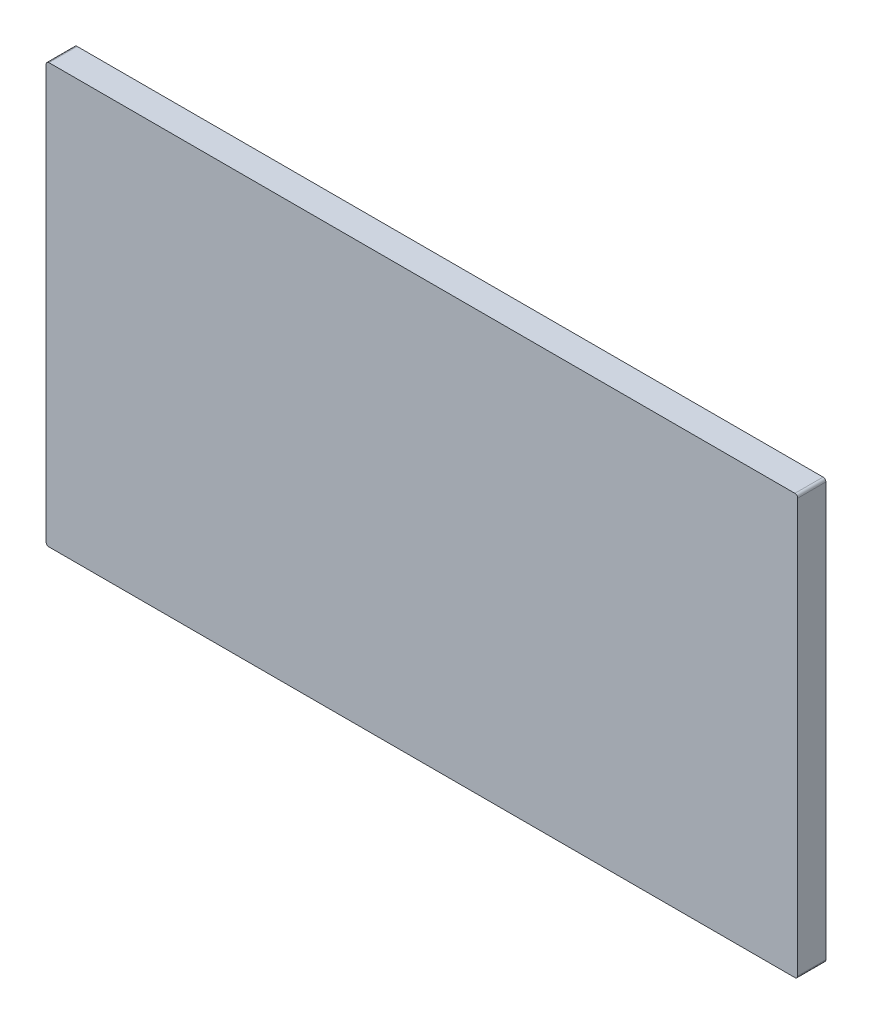
ISO-10303-21;
HEADER;
FILE_DESCRIPTION(('STEP AP214'),'2;1');
FILE_NAME('part.step','',(''),(''),'','','');
FILE_SCHEMA(('AUTOMOTIVE_DESIGN { 1 0 10303 214 1 1 1 1 }'));
ENDSEC;
DATA;
#1=APPLICATION_CONTEXT('core data for automotive mechanical design processes');
#2=APPLICATION_PROTOCOL_DEFINITION('international standard','automotive_design',2000,#1);
#3=PRODUCT_CONTEXT('',#1,'mechanical');
#4=PRODUCT('Part','Part','',(#3));
#5=PRODUCT_RELATED_PRODUCT_CATEGORY('part','',(#4));
#6=PRODUCT_DEFINITION_FORMATION('','',#4);
#7=PRODUCT_DEFINITION_CONTEXT('part definition',#1,'design');
#8=PRODUCT_DEFINITION('design','',#6,#7);
#9=PRODUCT_DEFINITION_SHAPE('','',#8);
#10=(LENGTH_UNIT() NAMED_UNIT(*) SI_UNIT(.MILLI.,.METRE.));
#11=(NAMED_UNIT(*) PLANE_ANGLE_UNIT() SI_UNIT($,.RADIAN.));
#12=(NAMED_UNIT(*) SI_UNIT($,.STERADIAN.) SOLID_ANGLE_UNIT());
#13=UNCERTAINTY_MEASURE_WITH_UNIT(LENGTH_MEASURE(1.E-05),#10,'distance_accuracy_value','');
#14=(GEOMETRIC_REPRESENTATION_CONTEXT(3) GLOBAL_UNCERTAINTY_ASSIGNED_CONTEXT((#13)) GLOBAL_UNIT_ASSIGNED_CONTEXT((#10,
#11,#12)) REPRESENTATION_CONTEXT('',''));
#15=CARTESIAN_POINT('',(0.,0.,0.));
#16=DIRECTION('',(0.,0.,1.));
#17=DIRECTION('',(1.,0.,0.));
#18=AXIS2_PLACEMENT_3D('',#15,#16,#17);
#19=CARTESIAN_POINT('',(13.35,7.45,1.));
#20=DIRECTION('',(-1.,0.,0.));
#21=DIRECTION('',(0.,-1.,0.));
#22=AXIS2_PLACEMENT_3D('',#19,#20,#21);
#23=PLANE('',#22);
#24=DIRECTION('',(0.,1.,0.));
#25=VECTOR('',#24,1.);
#26=CARTESIAN_POINT('',(13.35,7.45,1.));
#27=LINE('',#26,#25);
#28=CARTESIAN_POINT('',(13.35,-7.35,1.));
#29=VERTEX_POINT('',#28);
#30=CARTESIAN_POINT('',(13.35,7.35,1.));
#31=VERTEX_POINT('',#30);
#32=EDGE_CURVE('E164',#29,#31,#27,.T.);
#33=ORIENTED_EDGE('',*,*,#32,.F.);
#34=DIRECTION('',(0.,0.,-1.));
#35=VECTOR('',#34,1.);
#36=CARTESIAN_POINT('',(13.35,-7.35,1.));
#37=LINE('',#36,#35);
#38=CARTESIAN_POINT('',(13.35,-7.35,0.));
#39=VERTEX_POINT('',#38);
#40=EDGE_CURVE('E11',#29,#39,#37,.T.);
#41=ORIENTED_EDGE('',*,*,#40,.T.);
#42=DIRECTION('',(0.,1.,0.));
#43=VECTOR('',#42,1.);
#44=CARTESIAN_POINT('',(13.35,7.45,0.));
#45=LINE('',#44,#43);
#46=CARTESIAN_POINT('',(13.35,7.35,0.));
#47=VERTEX_POINT('',#46);
#48=EDGE_CURVE('E160',#39,#47,#45,.T.);
#49=ORIENTED_EDGE('',*,*,#48,.T.);
#50=DIRECTION('',(0.,0.,-1.));
#51=VECTOR('',#50,1.);
#52=CARTESIAN_POINT('',(13.35,7.35,1.));
#53=LINE('',#52,#51);
#54=EDGE_CURVE('E42',#47,#31,#53,.F.);
#55=ORIENTED_EDGE('',*,*,#54,.T.);
#56=EDGE_LOOP('',(#33,#41,#49,#55));
#57=FACE_BOUND('',#56,.T.);
#58=ADVANCED_FACE('F34',(#57),#23,.F.);
#59=CARTESIAN_POINT('',(-13.35,7.45,1.));
#60=DIRECTION('',(0.,-1.,0.));
#61=DIRECTION('',(0.,0.,-1.));
#62=AXIS2_PLACEMENT_3D('',#59,#60,#61);
#63=PLANE('',#62);
#64=DIRECTION('',(-1.,0.,0.));
#65=VECTOR('',#64,1.);
#66=CARTESIAN_POINT('',(-13.35,7.45,0.));
#67=LINE('',#66,#65);
#68=CARTESIAN_POINT('',(13.25,7.45,0.));
#69=VERTEX_POINT('',#68);
#70=CARTESIAN_POINT('',(-13.25,7.45,0.));
#71=VERTEX_POINT('',#70);
#72=EDGE_CURVE('E179',#69,#71,#67,.T.);
#73=ORIENTED_EDGE('',*,*,#72,.T.);
#74=DIRECTION('',(0.,0.,-1.));
#75=VECTOR('',#74,1.);
#76=CARTESIAN_POINT('',(-13.25,7.45,1.));
#77=LINE('',#76,#75);
#78=CARTESIAN_POINT('',(-13.25,7.45,1.));
#79=VERTEX_POINT('',#78);
#80=EDGE_CURVE('E201',#71,#79,#77,.F.);
#81=ORIENTED_EDGE('',*,*,#80,.T.);
#82=DIRECTION('',(-1.,0.,0.));
#83=VECTOR('',#82,1.);
#84=CARTESIAN_POINT('',(-13.35,7.45,1.));
#85=LINE('',#84,#83);
#86=CARTESIAN_POINT('',(13.25,7.45,1.));
#87=VERTEX_POINT('',#86);
#88=EDGE_CURVE('E167',#87,#79,#85,.T.);
#89=ORIENTED_EDGE('',*,*,#88,.F.);
#90=DIRECTION('',(0.,0.,-1.));
#91=VECTOR('',#90,1.);
#92=CARTESIAN_POINT('',(13.25,7.45,1.));
#93=LINE('',#92,#91);
#94=EDGE_CURVE('E198',#87,#69,#93,.T.);
#95=ORIENTED_EDGE('',*,*,#94,.T.);
#96=EDGE_LOOP('',(#73,#81,#89,#95));
#97=FACE_BOUND('',#96,.T.);
#98=ADVANCED_FACE('F228',(#97),#63,.F.);
#99=CARTESIAN_POINT('',(-13.35,7.45,1.));
#100=DIRECTION('',(1.,0.,0.));
#101=DIRECTION('',(0.,0.,-1.));
#102=AXIS2_PLACEMENT_3D('',#99,#100,#101);
#103=PLANE('',#102);
#104=DIRECTION('',(0.,-1.,0.));
#105=VECTOR('',#104,1.);
#106=CARTESIAN_POINT('',(-13.35,7.45,1.));
#107=LINE('',#106,#105);
#108=CARTESIAN_POINT('',(-13.35,7.35,1.));
#109=VERTEX_POINT('',#108);
#110=CARTESIAN_POINT('',(-13.35,-7.35,1.));
#111=VERTEX_POINT('',#110);
#112=EDGE_CURVE('E171',#109,#111,#107,.T.);
#113=ORIENTED_EDGE('',*,*,#112,.F.);
#114=DIRECTION('',(0.,0.,-1.));
#115=VECTOR('',#114,1.);
#116=CARTESIAN_POINT('',(-13.35,7.35,1.));
#117=LINE('',#116,#115);
#118=CARTESIAN_POINT('',(-13.35,7.35,0.));
#119=VERTEX_POINT('',#118);
#120=EDGE_CURVE('E187',#109,#119,#117,.T.);
#121=ORIENTED_EDGE('',*,*,#120,.T.);
#122=DIRECTION('',(0.,-1.,0.));
#123=VECTOR('',#122,1.);
#124=CARTESIAN_POINT('',(-13.35,7.45,0.));
#125=LINE('',#124,#123);
#126=CARTESIAN_POINT('',(-13.35,-7.35,0.));
#127=VERTEX_POINT('',#126);
#128=EDGE_CURVE('E182',#119,#127,#125,.T.);
#129=ORIENTED_EDGE('',*,*,#128,.T.);
#130=DIRECTION('',(0.,0.,-1.));
#131=VECTOR('',#130,1.);
#132=CARTESIAN_POINT('',(-13.35,-7.35,1.));
#133=LINE('',#132,#131);
#134=EDGE_CURVE('E176',#127,#111,#133,.F.);
#135=ORIENTED_EDGE('',*,*,#134,.T.);
#136=EDGE_LOOP('',(#113,#121,#129,#135));
#137=FACE_BOUND('',#136,.T.);
#138=ADVANCED_FACE('F239',(#137),#103,.F.);
#139=CARTESIAN_POINT('',(-13.35,-7.45,1.));
#140=DIRECTION('',(0.,1.,0.));
#141=DIRECTION('',(0.,0.,1.));
#142=AXIS2_PLACEMENT_3D('',#139,#140,#141);
#143=PLANE('',#142);
#144=DIRECTION('',(1.,0.,0.));
#145=VECTOR('',#144,1.);
#146=CARTESIAN_POINT('',(-13.35,-7.45,1.));
#147=LINE('',#146,#145);
#148=CARTESIAN_POINT('',(-13.25,-7.45,1.));
#149=VERTEX_POINT('',#148);
#150=CARTESIAN_POINT('',(13.25,-7.45,1.));
#151=VERTEX_POINT('',#150);
#152=EDGE_CURVE('E174',#149,#151,#147,.T.);
#153=ORIENTED_EDGE('',*,*,#152,.F.);
#154=DIRECTION('',(0.,0.,-1.));
#155=VECTOR('',#154,1.);
#156=CARTESIAN_POINT('',(-13.25,-7.45,1.));
#157=LINE('',#156,#155);
#158=CARTESIAN_POINT('',(-13.25,-7.45,0.));
#159=VERTEX_POINT('',#158);
#160=EDGE_CURVE('E212',#149,#159,#157,.T.);
#161=ORIENTED_EDGE('',*,*,#160,.T.);
#162=DIRECTION('',(1.,0.,0.));
#163=VECTOR('',#162,1.);
#164=CARTESIAN_POINT('',(-13.35,-7.45,0.));
#165=LINE('',#164,#163);
#166=CARTESIAN_POINT('',(13.25,-7.45,0.));
#167=VERTEX_POINT('',#166);
#168=EDGE_CURVE('E168',#159,#167,#165,.T.);
#169=ORIENTED_EDGE('',*,*,#168,.T.);
#170=DIRECTION('',(0.,0.,-1.));
#171=VECTOR('',#170,1.);
#172=CARTESIAN_POINT('',(13.25,-7.45,1.));
#173=LINE('',#172,#171);
#174=EDGE_CURVE('E57',#167,#151,#173,.F.);
#175=ORIENTED_EDGE('',*,*,#174,.T.);
#176=EDGE_LOOP('',(#153,#161,#169,#175));
#177=FACE_BOUND('',#176,.T.);
#178=ADVANCED_FACE('F246',(#177),#143,.F.);
#179=CARTESIAN_POINT('',(0.,0.,1.));
#180=DIRECTION('',(0.,0.,1.));
#181=DIRECTION('',(1.,0.,0.));
#182=AXIS2_PLACEMENT_3D('',#179,#180,#181);
#183=PLANE('',#182);
#184=ORIENTED_EDGE('',*,*,#88,.T.);
#185=CARTESIAN_POINT('',(-13.25,7.35,1.));
#186=DIRECTION('',(0.,0.,1.));
#187=DIRECTION('',(1.,0.,0.));
#188=AXIS2_PLACEMENT_3D('',#185,#186,#187);
#189=CIRCLE('',#188,0.1);
#190=EDGE_CURVE('E209',#79,#109,#189,.T.);
#191=ORIENTED_EDGE('',*,*,#190,.T.);
#192=ORIENTED_EDGE('',*,*,#112,.T.);
#193=CARTESIAN_POINT('',(-13.25,-7.35,1.));
#194=DIRECTION('',(0.,0.,1.));
#195=DIRECTION('',(1.,0.,0.));
#196=AXIS2_PLACEMENT_3D('',#193,#194,#195);
#197=CIRCLE('',#196,0.1);
#198=EDGE_CURVE('E207',#111,#149,#197,.T.);
#199=ORIENTED_EDGE('',*,*,#198,.T.);
#200=ORIENTED_EDGE('',*,*,#152,.T.);
#201=CARTESIAN_POINT('',(13.25,-7.35,1.));
#202=DIRECTION('',(0.,0.,1.));
#203=DIRECTION('',(1.,0.,0.));
#204=AXIS2_PLACEMENT_3D('',#201,#202,#203);
#205=CIRCLE('',#204,0.1);
#206=EDGE_CURVE('E205',#151,#29,#205,.T.);
#207=ORIENTED_EDGE('',*,*,#206,.T.);
#208=ORIENTED_EDGE('',*,*,#32,.T.);
#209=CARTESIAN_POINT('',(13.25,7.35,1.));
#210=DIRECTION('',(0.,0.,1.));
#211=DIRECTION('',(1.,0.,0.));
#212=AXIS2_PLACEMENT_3D('',#209,#210,#211);
#213=CIRCLE('',#212,0.1);
#214=EDGE_CURVE('E203',#31,#87,#213,.T.);
#215=ORIENTED_EDGE('',*,*,#214,.T.);
#216=EDGE_LOOP('',(#184,#191,#192,#199,#200,#207,#208,#215));
#217=FACE_BOUND('',#216,.T.);
#218=ADVANCED_FACE('F222',(#217),#183,.T.);
#219=CARTESIAN_POINT('',(0.,0.,0.));
#220=DIRECTION('',(0.,0.,1.));
#221=DIRECTION('',(1.,0.,0.));
#222=AXIS2_PLACEMENT_3D('',#219,#220,#221);
#223=PLANE('',#222);
#224=DIRECTION('',(-1.,0.,0.));
#225=VECTOR('',#224,1.);
#226=CARTESIAN_POINT('',(10.872,-5.514,0.));
#227=LINE('',#226,#225);
#228=CARTESIAN_POINT('',(10.872,-5.514,0.));
#229=VERTEX_POINT('',#228);
#230=CARTESIAN_POINT('',(-10.872,-5.514,0.));
#231=VERTEX_POINT('',#230);
#232=EDGE_CURVE('E154',#229,#231,#227,.T.);
#233=ORIENTED_EDGE('',*,*,#232,.F.);
#234=DIRECTION('',(0.,-1.,0.));
#235=VECTOR('',#234,1.);
#236=CARTESIAN_POINT('',(10.872,5.35,0.));
#237=LINE('',#236,#235);
#238=CARTESIAN_POINT('',(10.872,5.35,0.));
#239=VERTEX_POINT('',#238);
#240=EDGE_CURVE('E49',#239,#229,#237,.T.);
#241=ORIENTED_EDGE('',*,*,#240,.F.);
#242=DIRECTION('',(1.,0.,0.));
#243=VECTOR('',#242,1.);
#244=CARTESIAN_POINT('',(10.872,5.35,0.));
#245=LINE('',#244,#243);
#246=CARTESIAN_POINT('',(-10.872,5.35,0.));
#247=VERTEX_POINT('',#246);
#248=EDGE_CURVE('E145',#247,#239,#245,.T.);
#249=ORIENTED_EDGE('',*,*,#248,.F.);
#250=DIRECTION('',(0.,1.,0.));
#251=VECTOR('',#250,1.);
#252=CARTESIAN_POINT('',(-10.872,5.35,0.));
#253=LINE('',#252,#251);
#254=EDGE_CURVE('E148',#231,#247,#253,.T.);
#255=ORIENTED_EDGE('',*,*,#254,.F.);
#256=EDGE_LOOP('',(#233,#241,#249,#255));
#257=FACE_BOUND('',#256,.T.);
#258=ORIENTED_EDGE('',*,*,#128,.F.);
#259=CARTESIAN_POINT('',(-13.25,7.35,0.));
#260=DIRECTION('',(0.,0.,1.));
#261=DIRECTION('',(1.,0.,0.));
#262=AXIS2_PLACEMENT_3D('',#259,#260,#261);
#263=CIRCLE('',#262,0.1);
#264=EDGE_CURVE('E196',#119,#71,#263,.F.);
#265=ORIENTED_EDGE('',*,*,#264,.T.);
#266=ORIENTED_EDGE('',*,*,#72,.F.);
#267=CARTESIAN_POINT('',(13.25,7.35,0.));
#268=DIRECTION('',(0.,0.,1.));
#269=DIRECTION('',(1.,0.,0.));
#270=AXIS2_PLACEMENT_3D('',#267,#268,#269);
#271=CIRCLE('',#270,0.1);
#272=EDGE_CURVE('E190',#69,#47,#271,.F.);
#273=ORIENTED_EDGE('',*,*,#272,.T.);
#274=ORIENTED_EDGE('',*,*,#48,.F.);
#275=CARTESIAN_POINT('',(13.25,-7.35,0.));
#276=DIRECTION('',(0.,0.,1.));
#277=DIRECTION('',(1.,0.,0.));
#278=AXIS2_PLACEMENT_3D('',#275,#276,#277);
#279=CIRCLE('',#278,0.1);
#280=EDGE_CURVE('E192',#39,#167,#279,.F.);
#281=ORIENTED_EDGE('',*,*,#280,.T.);
#282=ORIENTED_EDGE('',*,*,#168,.F.);
#283=CARTESIAN_POINT('',(-13.25,-7.35,0.));
#284=DIRECTION('',(0.,0.,1.));
#285=DIRECTION('',(1.,0.,0.));
#286=AXIS2_PLACEMENT_3D('',#283,#284,#285);
#287=CIRCLE('',#286,0.1);
#288=EDGE_CURVE('E194',#159,#127,#287,.F.);
#289=ORIENTED_EDGE('',*,*,#288,.T.);
#290=EDGE_LOOP('',(#258,#265,#266,#273,#274,#281,#282,#289));
#291=FACE_BOUND('',#290,.T.);
#292=ADVANCED_FACE('F232',(#257,#291),#223,.F.);
#293=CARTESIAN_POINT('',(-13.25,7.35,1.));
#294=DIRECTION('',(0.,0.,-1.));
#295=DIRECTION('',(-1.,0.,0.));
#296=AXIS2_PLACEMENT_3D('',#293,#294,#295);
#297=CYLINDRICAL_SURFACE('',#296,0.1);
#298=ORIENTED_EDGE('',*,*,#190,.F.);
#299=ORIENTED_EDGE('',*,*,#80,.F.);
#300=ORIENTED_EDGE('',*,*,#264,.F.);
#301=ORIENTED_EDGE('',*,*,#120,.F.);
#302=EDGE_LOOP('',(#298,#299,#300,#301));
#303=FACE_BOUND('',#302,.T.);
#304=ADVANCED_FACE('F236',(#303),#297,.T.);
#305=CARTESIAN_POINT('',(-13.25,-7.35,1.));
#306=DIRECTION('',(0.,0.,-1.));
#307=DIRECTION('',(-1.,0.,0.));
#308=AXIS2_PLACEMENT_3D('',#305,#306,#307);
#309=CYLINDRICAL_SURFACE('',#308,0.1);
#310=ORIENTED_EDGE('',*,*,#198,.F.);
#311=ORIENTED_EDGE('',*,*,#134,.F.);
#312=ORIENTED_EDGE('',*,*,#288,.F.);
#313=ORIENTED_EDGE('',*,*,#160,.F.);
#314=EDGE_LOOP('',(#310,#311,#312,#313));
#315=FACE_BOUND('',#314,.T.);
#316=ADVANCED_FACE('F244',(#315),#309,.T.);
#317=CARTESIAN_POINT('',(13.25,-7.35,1.));
#318=DIRECTION('',(0.,0.,-1.));
#319=DIRECTION('',(-1.,0.,0.));
#320=AXIS2_PLACEMENT_3D('',#317,#318,#319);
#321=CYLINDRICAL_SURFACE('',#320,0.1);
#322=ORIENTED_EDGE('',*,*,#206,.F.);
#323=ORIENTED_EDGE('',*,*,#174,.F.);
#324=ORIENTED_EDGE('',*,*,#280,.F.);
#325=ORIENTED_EDGE('',*,*,#40,.F.);
#326=EDGE_LOOP('',(#322,#323,#324,#325));
#327=FACE_BOUND('',#326,.T.);
#328=ADVANCED_FACE('F248',(#327),#321,.T.);
#329=CARTESIAN_POINT('',(13.25,7.35,1.));
#330=DIRECTION('',(0.,0.,-1.));
#331=DIRECTION('',(-1.,0.,0.));
#332=AXIS2_PLACEMENT_3D('',#329,#330,#331);
#333=CYLINDRICAL_SURFACE('',#332,0.1);
#334=ORIENTED_EDGE('',*,*,#214,.F.);
#335=ORIENTED_EDGE('',*,*,#54,.F.);
#336=ORIENTED_EDGE('',*,*,#272,.F.);
#337=ORIENTED_EDGE('',*,*,#94,.F.);
#338=EDGE_LOOP('',(#334,#335,#336,#337));
#339=FACE_BOUND('',#338,.T.);
#340=ADVANCED_FACE('F36',(#339),#333,.T.);
#341=CARTESIAN_POINT('',(10.872,5.35,0.1));
#342=DIRECTION('',(1.,0.,0.));
#343=DIRECTION('',(0.,1.,0.));
#344=AXIS2_PLACEMENT_3D('',#341,#342,#343);
#345=PLANE('',#344);
#346=ORIENTED_EDGE('',*,*,#240,.T.);
#347=DIRECTION('',(0.,0.,-1.));
#348=VECTOR('',#347,1.);
#349=CARTESIAN_POINT('',(10.872,-5.514,0.1));
#350=LINE('',#349,#348);
#351=CARTESIAN_POINT('',(10.872,-5.514,0.1));
#352=VERTEX_POINT('',#351);
#353=EDGE_CURVE('E123',#352,#229,#350,.T.);
#354=ORIENTED_EDGE('',*,*,#353,.F.);
#355=DIRECTION('',(0.,-1.,0.));
#356=VECTOR('',#355,1.);
#357=CARTESIAN_POINT('',(10.872,5.35,0.1));
#358=LINE('',#357,#356);
#359=CARTESIAN_POINT('',(10.872,5.35,0.1));
#360=VERTEX_POINT('',#359);
#361=EDGE_CURVE('E127',#360,#352,#358,.T.);
#362=ORIENTED_EDGE('',*,*,#361,.F.);
#363=DIRECTION('',(0.,0.,-1.));
#364=VECTOR('',#363,1.);
#365=CARTESIAN_POINT('',(10.872,5.35,0.1));
#366=LINE('',#365,#364);
#367=EDGE_CURVE('E158',#360,#239,#366,.T.);
#368=ORIENTED_EDGE('',*,*,#367,.T.);
#369=EDGE_LOOP('',(#346,#354,#362,#368));
#370=FACE_BOUND('',#369,.T.);
#371=ADVANCED_FACE('F125',(#370),#345,.F.);
#372=CARTESIAN_POINT('',(10.872,5.35,0.1));
#373=DIRECTION('',(0.,1.,0.));
#374=DIRECTION('',(0.,0.,1.));
#375=AXIS2_PLACEMENT_3D('',#372,#373,#374);
#376=PLANE('',#375);
#377=ORIENTED_EDGE('',*,*,#248,.T.);
#378=ORIENTED_EDGE('',*,*,#367,.F.);
#379=DIRECTION('',(1.,0.,0.));
#380=VECTOR('',#379,1.);
#381=CARTESIAN_POINT('',(10.872,5.35,0.1));
#382=LINE('',#381,#380);
#383=CARTESIAN_POINT('',(-10.872,5.35,0.1));
#384=VERTEX_POINT('',#383);
#385=EDGE_CURVE('E133',#384,#360,#382,.T.);
#386=ORIENTED_EDGE('',*,*,#385,.F.);
#387=DIRECTION('',(0.,0.,-1.));
#388=VECTOR('',#387,1.);
#389=CARTESIAN_POINT('',(-10.872,5.35,0.1));
#390=LINE('',#389,#388);
#391=EDGE_CURVE('E161',#384,#247,#390,.T.);
#392=ORIENTED_EDGE('',*,*,#391,.T.);
#393=EDGE_LOOP('',(#377,#378,#386,#392));
#394=FACE_BOUND('',#393,.T.);
#395=ADVANCED_FACE('F321',(#394),#376,.F.);
#396=CARTESIAN_POINT('',(-10.872,5.35,0.1));
#397=DIRECTION('',(-1.,0.,0.));
#398=DIRECTION('',(0.,0.,1.));
#399=AXIS2_PLACEMENT_3D('',#396,#397,#398);
#400=PLANE('',#399);
#401=ORIENTED_EDGE('',*,*,#254,.T.);
#402=ORIENTED_EDGE('',*,*,#391,.F.);
#403=DIRECTION('',(0.,1.,0.));
#404=VECTOR('',#403,1.);
#405=CARTESIAN_POINT('',(-10.872,5.35,0.1));
#406=LINE('',#405,#404);
#407=CARTESIAN_POINT('',(-10.872,-5.514,0.1));
#408=VERTEX_POINT('',#407);
#409=EDGE_CURVE('E141',#408,#384,#406,.T.);
#410=ORIENTED_EDGE('',*,*,#409,.F.);
#411=DIRECTION('',(0.,0.,-1.));
#412=VECTOR('',#411,1.);
#413=CARTESIAN_POINT('',(-10.872,-5.514,0.1));
#414=LINE('',#413,#412);
#415=EDGE_CURVE('E132',#408,#231,#414,.T.);
#416=ORIENTED_EDGE('',*,*,#415,.T.);
#417=EDGE_LOOP('',(#401,#402,#410,#416));
#418=FACE_BOUND('',#417,.T.);
#419=ADVANCED_FACE('F328',(#418),#400,.F.);
#420=CARTESIAN_POINT('',(10.872,-5.514,0.1));
#421=DIRECTION('',(0.,-1.,0.));
#422=DIRECTION('',(0.,0.,-1.));
#423=AXIS2_PLACEMENT_3D('',#420,#421,#422);
#424=PLANE('',#423);
#425=ORIENTED_EDGE('',*,*,#232,.T.);
#426=ORIENTED_EDGE('',*,*,#415,.F.);
#427=DIRECTION('',(-1.,0.,0.));
#428=VECTOR('',#427,1.);
#429=CARTESIAN_POINT('',(10.872,-5.514,0.1));
#430=LINE('',#429,#428);
#431=EDGE_CURVE('E136',#352,#408,#430,.T.);
#432=ORIENTED_EDGE('',*,*,#431,.F.);
#433=ORIENTED_EDGE('',*,*,#353,.T.);
#434=EDGE_LOOP('',(#425,#426,#432,#433));
#435=FACE_BOUND('',#434,.T.);
#436=ADVANCED_FACE('F137',(#435),#424,.F.);
#437=CARTESIAN_POINT('',(0.,0.,0.1));
#438=DIRECTION('',(0.,0.,-1.));
#439=DIRECTION('',(-1.,0.,0.));
#440=AXIS2_PLACEMENT_3D('',#437,#438,#439);
#441=PLANE('',#440);
#442=ORIENTED_EDGE('',*,*,#361,.T.);
#443=ORIENTED_EDGE('',*,*,#431,.T.);
#444=ORIENTED_EDGE('',*,*,#409,.T.);
#445=ORIENTED_EDGE('',*,*,#385,.T.);
#446=EDGE_LOOP('',(#442,#443,#444,#445));
#447=FACE_BOUND('',#446,.T.);
#448=ADVANCED_FACE('F143',(#447),#441,.T.);
#449=CLOSED_SHELL('',(#58,#98,#138,#178,#218,#292,#304,#316,#328,#340,#371,#395,#419,#436,#448));
#450=MANIFOLD_SOLID_BREP('B2',#449);
#451=ADVANCED_BREP_SHAPE_REPRESENTATION('',(#18,#450),#14);
#452=SHAPE_DEFINITION_REPRESENTATION(#9,#451);
ENDSEC;
END-ISO-10303-21;
